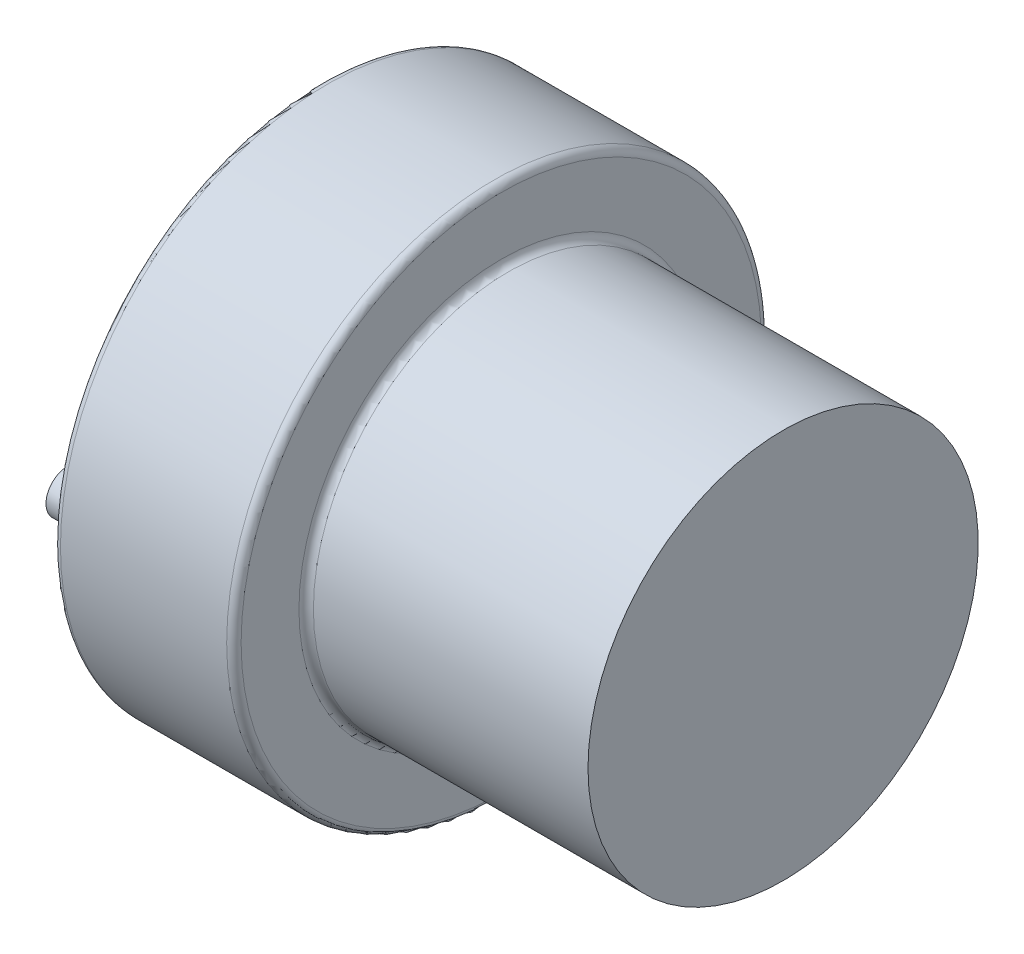
ISO-10303-21;
HEADER;
FILE_DESCRIPTION(('STEP AP214'),'2;1');
FILE_NAME('part.step','',(''),(''),'','','');
FILE_SCHEMA(('AUTOMOTIVE_DESIGN { 1 0 10303 214 1 1 1 1 }'));
ENDSEC;
DATA;
#1=APPLICATION_CONTEXT('core data for automotive mechanical design processes');
#2=APPLICATION_PROTOCOL_DEFINITION('international standard','automotive_design',2000,#1);
#3=PRODUCT_CONTEXT('',#1,'mechanical');
#4=PRODUCT('Part','Part','',(#3));
#5=PRODUCT_RELATED_PRODUCT_CATEGORY('part','',(#4));
#6=PRODUCT_DEFINITION_FORMATION('','',#4);
#7=PRODUCT_DEFINITION_CONTEXT('part definition',#1,'design');
#8=PRODUCT_DEFINITION('design','',#6,#7);
#9=PRODUCT_DEFINITION_SHAPE('','',#8);
#10=(LENGTH_UNIT() NAMED_UNIT(*) SI_UNIT(.MILLI.,.METRE.));
#11=(NAMED_UNIT(*) PLANE_ANGLE_UNIT() SI_UNIT($,.RADIAN.));
#12=(NAMED_UNIT(*) SI_UNIT($,.STERADIAN.) SOLID_ANGLE_UNIT());
#13=UNCERTAINTY_MEASURE_WITH_UNIT(LENGTH_MEASURE(1.E-05),#10,'distance_accuracy_value','');
#14=(GEOMETRIC_REPRESENTATION_CONTEXT(3) GLOBAL_UNCERTAINTY_ASSIGNED_CONTEXT((#13)) GLOBAL_UNIT_ASSIGNED_CONTEXT((#10,
#11,#12)) REPRESENTATION_CONTEXT('',''));
#15=CARTESIAN_POINT('',(0.,0.,0.));
#16=DIRECTION('',(0.,0.,1.));
#17=DIRECTION('',(1.,0.,0.));
#18=AXIS2_PLACEMENT_3D('',#15,#16,#17);
#19=CARTESIAN_POINT('',(47.3215054741171,37.,0.));
#20=DIRECTION('',(-1.,0.,0.));
#21=DIRECTION('',(0.,0.,1.));
#22=AXIS2_PLACEMENT_3D('',#19,#20,#21);
#23=PLANE('',#22);
#24=CARTESIAN_POINT('',(47.3215054741171,0.,0.));
#25=DIRECTION('',(-1.,0.,0.));
#26=DIRECTION('',(0.,0.,1.));
#27=AXIS2_PLACEMENT_3D('',#24,#25,#26);
#28=CIRCLE('',#27,28.);
#29=CARTESIAN_POINT('',(47.3215054741171,0.,28.));
#30=VERTEX_POINT('',#29);
#31=EDGE_CURVE('E129',#30,#30,#28,.T.);
#32=ORIENTED_EDGE('',*,*,#31,.T.);
#33=EDGE_LOOP('',(#32));
#34=FACE_BOUND('',#33,.T.);
#35=CARTESIAN_POINT('',(47.3215054741171,0.,0.));
#36=DIRECTION('',(-1.,0.,0.));
#37=DIRECTION('',(0.,0.,1.));
#38=AXIS2_PLACEMENT_3D('',#35,#36,#37);
#39=CIRCLE('',#38,36.);
#40=CARTESIAN_POINT('',(47.3215054741171,0.,36.));
#41=VERTEX_POINT('',#40);
#42=EDGE_CURVE('E132',#41,#41,#39,.F.);
#43=ORIENTED_EDGE('',*,*,#42,.T.);
#44=EDGE_LOOP('',(#43));
#45=FACE_BOUND('',#44,.T.);
#46=ADVANCED_FACE('F35',(#34,#45),#23,.F.);
#47=CARTESIAN_POINT('',(-66.563531294074,0.,0.));
#48=DIRECTION('',(-1.,0.,0.));
#49=DIRECTION('',(0.,0.,1.));
#50=AXIS2_PLACEMENT_3D('',#47,#48,#49);
#51=CYLINDRICAL_SURFACE('',#50,27.);
#52=CARTESIAN_POINT('',(48.3215054741171,0.,0.));
#53=DIRECTION('',(-1.,0.,0.));
#54=DIRECTION('',(0.,0.,1.));
#55=AXIS2_PLACEMENT_3D('',#52,#53,#54);
#56=CIRCLE('',#55,27.);
#57=CARTESIAN_POINT('',(48.3215054741171,0.,27.));
#58=VERTEX_POINT('',#57);
#59=EDGE_CURVE('E79',#58,#58,#56,.F.);
#60=ORIENTED_EDGE('',*,*,#59,.T.);
#61=EDGE_LOOP('',(#60));
#62=FACE_BOUND('',#61,.T.);
#63=CARTESIAN_POINT('',(86.3215054741171,0.,0.));
#64=DIRECTION('',(-1.,0.,0.));
#65=DIRECTION('',(0.,0.,1.));
#66=AXIS2_PLACEMENT_3D('',#63,#64,#65);
#67=CIRCLE('',#66,27.);
#68=CARTESIAN_POINT('',(86.3215054741171,0.,27.));
#69=VERTEX_POINT('',#68);
#70=EDGE_CURVE('E84',#69,#69,#67,.T.);
#71=ORIENTED_EDGE('',*,*,#70,.T.);
#72=EDGE_LOOP('',(#71));
#73=FACE_BOUND('',#72,.T.);
#74=ADVANCED_FACE('F168',(#62,#73),#51,.T.);
#75=CARTESIAN_POINT('',(86.3215054741171,27.,0.));
#76=DIRECTION('',(-1.,0.,0.));
#77=DIRECTION('',(0.,0.,1.));
#78=AXIS2_PLACEMENT_3D('',#75,#76,#77);
#79=PLANE('',#78);
#80=ORIENTED_EDGE('',*,*,#70,.F.);
#81=EDGE_LOOP('',(#80));
#82=FACE_BOUND('',#81,.T.);
#83=ADVANCED_FACE('F173',(#82),#79,.F.);
#84=CARTESIAN_POINT('',(22.3215054741171,0.,0.));
#85=DIRECTION('',(1.,0.,0.));
#86=DIRECTION('',(0.,0.,-1.));
#87=AXIS2_PLACEMENT_3D('',#84,#85,#86);
#88=PLANE('',#87);
#89=CARTESIAN_POINT('',(22.3215054741171,-29.8,0.));
#90=DIRECTION('',(1.,0.,0.));
#91=DIRECTION('',(0.,0.,-1.));
#92=AXIS2_PLACEMENT_3D('',#89,#90,#91);
#93=CIRCLE('',#92,7.);
#94=CARTESIAN_POINT('',(22.3215054741171,-35.8228187919463,-3.56730343528252));
#95=VERTEX_POINT('',#94);
#96=CARTESIAN_POINT('',(22.3215054741171,-35.8228187919463,3.56730343528252));
#97=VERTEX_POINT('',#96);
#98=EDGE_CURVE('E138',#95,#97,#93,.T.);
#99=ORIENTED_EDGE('',*,*,#98,.T.);
#100=CARTESIAN_POINT('',(22.3215054741171,0.,0.));
#101=DIRECTION('',(1.,0.,0.));
#102=DIRECTION('',(0.,0.,-1.));
#103=AXIS2_PLACEMENT_3D('',#100,#101,#102);
#104=CIRCLE('',#103,36.);
#105=EDGE_CURVE('E11',#97,#95,#104,.F.);
#106=ORIENTED_EDGE('',*,*,#105,.T.);
#107=EDGE_LOOP('',(#99,#106));
#108=FACE_BOUND('',#107,.T.);
#109=ADVANCED_FACE('F118',(#108),#88,.F.);
#110=CARTESIAN_POINT('',(-66.563531294074,0.,0.));
#111=DIRECTION('',(-1.,0.,0.));
#112=DIRECTION('',(0.,0.,1.));
#113=AXIS2_PLACEMENT_3D('',#110,#111,#112);
#114=CYLINDRICAL_SURFACE('',#113,37.);
#115=CARTESIAN_POINT('',(46.3215054741171,0.,0.));
#116=DIRECTION('',(-1.,0.,0.));
#117=DIRECTION('',(0.,0.,1.));
#118=AXIS2_PLACEMENT_3D('',#115,#116,#117);
#119=CIRCLE('',#118,37.);
#120=CARTESIAN_POINT('',(46.3215054741171,0.,37.));
#121=VERTEX_POINT('',#120);
#122=EDGE_CURVE('E75',#121,#121,#119,.T.);
#123=ORIENTED_EDGE('',*,*,#122,.T.);
#124=EDGE_LOOP('',(#123));
#125=FACE_BOUND('',#124,.T.);
#126=CARTESIAN_POINT('',(23.0496032626109,-36.5573468185837,-5.70617153490735));
#127=CARTESIAN_POINT('',(21.5795723692287,-36.6331610593214,-5.22045751886715));
#128=CARTESIAN_POINT('',(22.185554368364,-35.2065799035611,-5.20288610092809));
#129=CARTESIAN_POINT('',(23.0943157213255,-36.5785919458054,-5.57013755854584));
#130=CARTESIAN_POINT('',(21.6562160800355,-36.64182692597,-5.15348583219534));
#131=CARTESIAN_POINT('',(22.2079105976951,-35.2501493648659,-5.10217913031525));
#132=CARTESIAN_POINT('',(23.132081449152,-36.5993855184465,-5.43186633475085));
#133=CARTESIAN_POINT('',(21.7295336195492,-36.6526109350845,-5.07219857825357));
#134=CARTESIAN_POINT('',(22.2267934616215,-35.2941650324794,-4.99825919530411));
#135=CARTESIAN_POINT('',(23.195666505471,-36.6397407809534,-5.15257413559786));
#136=CARTESIAN_POINT('',(21.863858717514,-36.6764376530142,-4.89038965588562));
#137=CARTESIAN_POINT('',(22.2585859898072,-35.3822201060277,-4.78491327948831));
#138=CARTESIAN_POINT('',(23.2215123385418,-36.659305119534,-5.01155999463573));
#139=CARTESIAN_POINT('',(21.9255377931763,-36.689406368355,-4.79051951106501));
#140=CARTESIAN_POINT('',(22.2715089063556,-35.4262592391699,-4.67550012026306));
#141=CARTESIAN_POINT('',(23.263235040649,-36.6968344474696,-4.72891163866181));
#142=CARTESIAN_POINT('',(22.0361065105242,-36.7161692234794,-4.5778579154632));
#143=CARTESIAN_POINT('',(22.2923702573571,-35.5133780746318,-4.45244076123918));
#144=CARTESIAN_POINT('',(23.2791826330043,-36.7148099772626,-4.5872892776558));
#145=CARTESIAN_POINT('',(22.0856482904213,-36.7299508957794,-4.46544188879981));
#146=CARTESIAN_POINT('',(22.3003440534702,-35.5564624115411,-4.33883088490669));
#147=CARTESIAN_POINT('',(23.3031057226785,-36.7491994221087,-4.30311695377634));
#148=CARTESIAN_POINT('',(22.1736243090161,-36.7575493099456,-4.23096114213698));
#149=CARTESIAN_POINT('',(22.3123055983135,-35.6413946786779,-4.10692828013747));
#150=CARTESIAN_POINT('',(23.3110785702217,-36.7656128164716,-4.16056669841534));
#151=CARTESIAN_POINT('',(22.2125212503593,-36.7713976301361,-4.10892986892763));
#152=CARTESIAN_POINT('',(22.3162920221559,-35.6832421934663,-3.98863400877618));
#153=CARTESIAN_POINT('',(23.3177987707606,-36.787596624106,-3.95931882207973));
#154=CARTESIAN_POINT('',(22.2608635220134,-36.7906914753863,-3.93045708611478));
#155=CARTESIAN_POINT('',(22.3196521224444,-35.7409418503055,-3.81874077623764));
#156=CARTESIAN_POINT('',(23.3192138182394,-36.7938509370974,-3.90076946071516));
#157=CARTESIAN_POINT('',(22.2740159819821,-36.7962106472934,-3.87842591731761));
#158=CARTESIAN_POINT('',(22.3203596461797,-35.7575642615729,-3.76896944635886));
#159=CARTESIAN_POINT('',(23.3210671354643,-36.8060825639846,-3.78361656785558));
#160=CARTESIAN_POINT('',(22.2988158669579,-36.8071311318768,-3.77331907895815));
#161=CARTESIAN_POINT('',(22.3212863047866,-35.7904621249422,-3.66868739133214));
#162=CARTESIAN_POINT('',(23.321505274551,-36.8120598407227,-3.72501303016311));
#163=CARTESIAN_POINT('',(22.3104853876519,-36.8125360164771,-3.72023365454792));
#164=CARTESIAN_POINT('',(22.3215053743286,-35.8067375303444,-3.61817656818788));
#165=CARTESIAN_POINT('',(23.3215060558089,-36.8349114084879,-3.49553696715631));
#166=CARTESIAN_POINT('',(22.3529483028792,-36.8331934663434,-3.51278175748993));
#167=CARTESIAN_POINT('',(22.321505764979,-35.8696921710224,-3.4190193203605));
#168=CARTESIAN_POINT('',(23.3177859222851,-36.8507360726404,-3.32455728641397));
#169=CARTESIAN_POINT('',(22.3791923436772,-36.8481782356315,-3.35257624122744));
#170=CARTESIAN_POINT('',(22.3196456982918,-35.9149161127719,-3.26765703738701));
#171=CARTESIAN_POINT('',(23.3052853507849,-36.8799898663843,-2.98258568896001));
#172=CARTESIAN_POINT('',(22.421777661549,-36.8763545936427,-3.0269140085266));
#173=CARTESIAN_POINT('',(22.3133954123603,-36.0010814790415,-2.9590120428776));
#174=CARTESIAN_POINT('',(23.2965037839552,-36.893418460704,-2.8115937780299));
#175=CARTESIAN_POINT('',(22.4384531476647,-36.8896426716794,-2.86102241134309));
#176=CARTESIAN_POINT('',(22.3090046286893,-36.042021945809,-2.80172801793001));
#177=CARTESIAN_POINT('',(23.2761438787302,-36.9179001497763,-2.46943311257299));
#178=CARTESIAN_POINT('',(22.4643633709563,-36.9141315140195,-2.52537597550229));
#179=CARTESIAN_POINT('',(22.2988246760662,-36.1186654037567,-2.48137005992551));
#180=CARTESIAN_POINT('',(23.264562432058,-36.9289505784642,-2.29826437350549));
#181=CARTESIAN_POINT('',(22.4738021039878,-36.9254213025376,-2.35508242197954));
#182=CARTESIAN_POINT('',(22.2930339529761,-36.1543625027295,-2.31828986510513));
#183=CARTESIAN_POINT('',(23.2408004012371,-36.9486675426824,-1.95585606979238));
#184=CARTESIAN_POINT('',(22.487511968837,-36.9456928168072,-2.01190709983078));
#185=CARTESIAN_POINT('',(22.2811529377653,-36.2194733815791,-1.98698402275845));
#186=CARTESIAN_POINT('',(23.2286198834771,-36.9573343416662,-1.78461651507069));
#187=CARTESIAN_POINT('',(22.4919018464305,-36.9547545706858,-1.83841700547601));
#188=CARTESIAN_POINT('',(22.2750626788389,-36.2488878557702,-1.81875894616211));
#189=CARTESIAN_POINT('',(23.2056940785022,-36.9722933308398,-1.44186023317155));
#190=CARTESIAN_POINT('',(22.4975944072469,-36.9704384367619,-1.48960048829226));
#191=CARTESIAN_POINT('',(22.263599776267,-36.3005124793115,-1.47780893675089));
#192=CARTESIAN_POINT('',(23.1949493429095,-36.978584610049,-1.27034342494164));
#193=CARTESIAN_POINT('',(22.4989493524597,-36.9771243876591,-1.31359545049608));
#194=CARTESIAN_POINT('',(22.2582274084325,-36.3227198643794,-1.30508230473788));
#195=CARTESIAN_POINT('',(23.1766497326258,-36.9887828166206,-0.927054119491453));
#196=CARTESIAN_POINT('',(22.5002876239622,-36.9879601568902,-0.96059179457783));
#197=CARTESIAN_POINT('',(22.2490776033566,-36.3591065824519,-0.956276941473251));
#198=CARTESIAN_POINT('',(23.1690947664913,-36.9926898123365,-0.755281629742683));
#199=CARTESIAN_POINT('',(22.500286594406,-36.9921565119264,-0.782858970981471));
#200=CARTESIAN_POINT('',(22.2453001203934,-36.3732861456002,-0.780198306467286));
#201=CARTESIAN_POINT('',(23.1584287872938,-36.9981075478377,-0.41172567372295));
#202=CARTESIAN_POINT('',(22.500104283379,-36.9979582380011,-0.427396354164905));
#203=CARTESIAN_POINT('',(22.2399671306164,-36.3930306231839,-0.42631100465247));
#204=CARTESIAN_POINT('',(23.1553131097378,-36.9996208029823,-0.239942408916912));
#205=CARTESIAN_POINT('',(22.4999236917539,-36.999591828673,-0.248894040099966));
#206=CARTESIAN_POINT('',(22.2384092915566,-36.398604580302,-0.248504351667758));
#207=CARTESIAN_POINT('',(23.1540145132723,-37.000253681395,0.103647521352708));
#208=CARTESIAN_POINT('',(22.4998532241512,-37.0002731418973,0.107437709730619));
#209=CARTESIAN_POINT('',(22.2377599933074,-36.4009340850238,0.107341089168888));
#210=CARTESIAN_POINT('',(23.155831556064,-36.9993733232478,0.275454186624248));
#211=CARTESIAN_POINT('',(22.4999630194116,-36.9993239095812,0.286057435108324));
#212=CARTESIAN_POINT('',(22.2386685149686,-36.397689701095,0.285379875207761));
#213=CARTESIAN_POINT('',(23.166522897989,-36.9940419931226,0.716519274867622));
#214=CARTESIAN_POINT('',(22.5003250929783,-36.993593668793,0.743342362099668));
#215=CARTESIAN_POINT('',(22.2440141862443,-36.3781742184994,0.740724941661782));
#216=CARTESIAN_POINT('',(23.1788212807392,-36.9878460189078,0.985666408513064));
#217=CARTESIAN_POINT('',(22.5006251270284,-36.9868835702444,1.02286424840874));
#218=CARTESIAN_POINT('',(22.2501633774581,-36.3555473251459,1.01693875802849));
#219=CARTESIAN_POINT('',(23.2102244512467,-36.9696024560881,1.52347989689025));
#220=CARTESIAN_POINT('',(22.4969529296883,-36.9675688254964,1.57444304943322));
#221=CARTESIAN_POINT('',(22.2658649626248,-36.2910447314259,1.56029980213849));
#222=CARTESIAN_POINT('',(23.2293343592609,-36.9575504630031,1.79214573672455));
#223=CARTESIAN_POINT('',(22.4928848495874,-36.9547570211431,1.84926629790581));
#224=CARTESIAN_POINT('',(22.2754199167065,-36.2491545438549,1.82744004332052));
#225=CARTESIAN_POINT('',(23.2667322862324,-36.9276382375231,2.32839928535308));
#226=CARTESIAN_POINT('',(22.4733818881282,-36.9239112548409,2.38799861611297));
#227=CARTESIAN_POINT('',(22.2941188801574,-36.1497605449315,2.34833492332293));
#228=CARTESIAN_POINT('',(23.2850226039061,-36.9097955802178,2.59598780673007));
#229=CARTESIAN_POINT('',(22.4575635755883,-36.9055916418608,2.65432849604766));
#230=CARTESIAN_POINT('',(22.3032640388855,-36.0923040645138,2.60212739863556));
#231=CARTESIAN_POINT('',(23.3124092283033,-36.8682403473535,3.1312641280184));
#232=CARTESIAN_POINT('',(22.406513813467,-36.8646306397308,3.17341403957862));
#233=CARTESIAN_POINT('',(22.3169573511661,-35.9655176730531,3.09555241750385));
#234=CARTESIAN_POINT('',(23.321508305211,-36.8445295431024,3.39895187367705));
#235=CARTESIAN_POINT('',(22.3702746164429,-36.8416264760928,3.42805989764088));
#236=CARTESIAN_POINT('',(22.3215068898107,-35.8961913468812,3.33518920698389));
#237=CARTESIAN_POINT('',(23.3215036583917,-36.8008163373736,3.83792029092276));
#238=CARTESIAN_POINT('',(22.2889226399398,-36.8020434072165,3.82562784284298));
#239=CARTESIAN_POINT('',(22.3215045661604,-35.7757612166246,3.71617017150417));
#240=CARTESIAN_POINT('',(23.317757942586,-36.7825338179751,4.00934484605691));
#241=CARTESIAN_POINT('',(22.2505630305021,-36.7857730311227,3.97852937586324));
#242=CARTESIAN_POINT('',(22.3196317080247,-35.7270393005748,3.86194264250082));
#243=CARTESIAN_POINT('',(23.3002134162989,-36.7436541259377,4.35125839047812));
#244=CARTESIAN_POINT('',(22.1602530145498,-36.7528561785761,4.27274940354854));
#245=CARTESIAN_POINT('',(22.3108594448795,-35.6273075084333,4.14688908586378));
#246=CARTESIAN_POINT('',(23.2864245786389,-36.7230592666,4.52174813894454));
#247=CARTESIAN_POINT('',(22.1076209891147,-36.7361343160085,4.41417673429082));
#248=CARTESIAN_POINT('',(22.3039650262802,-35.5762999491056,4.28606945827469));
#249=CARTESIAN_POINT('',(23.2456954411636,-36.6793817336019,4.86343485984208));
#250=CARTESIAN_POINT('',(21.9860618953946,-36.7031894791066,4.68278083457799));
#251=CARTESIAN_POINT('',(22.2836004577397,-35.4722216155292,4.55952898543568));
#252=CARTESIAN_POINT('',(23.2185660215549,-36.6562671207984,5.03460580017402));
#253=CARTESIAN_POINT('',(21.9159952507171,-36.6869610895821,4.80937311539495));
#254=CARTESIAN_POINT('',(22.2700357478978,-35.4191315889688,4.69370688119169));
#255=CARTESIAN_POINT('',(23.1654063891174,-36.6201661407214,5.28874348489617));
#256=CARTESIAN_POINT('',(21.8001122763335,-36.6648751659663,4.97879120252823));
#257=CARTESIAN_POINT('',(22.2434559315862,-35.3393422350653,4.88914286903021));
#258=CARTESIAN_POINT('',(23.1455581949763,-36.6078690300226,5.37318097110978));
#259=CARTESIAN_POINT('',(21.7586525459222,-36.6577539430218,5.03284514346185));
#260=CARTESIAN_POINT('',(22.2335318344785,-35.3126681241832,4.95343551263273));
#261=CARTESIAN_POINT('',(23.1011992450535,-36.5828810932661,5.54075949188271));
#262=CARTESIAN_POINT('',(21.6717844918171,-36.6445273886687,5.13330919979478));
#263=CARTESIAN_POINT('',(22.2113523594955,-35.2594644993986,5.07984894998553));
#264=CARTESIAN_POINT('',(23.0766848646007,-36.5701899675961,5.6238994638538));
#265=CARTESIAN_POINT('',(21.6262269201754,-36.6384462481235,5.17953767404167));
#266=CARTESIAN_POINT('',(22.1990951692845,-35.2329351145083,5.14196801060245));
#267=CARTESIAN_POINT('',(23.0496032626109,-36.5573468185837,5.70617153490735));
#268=CARTESIAN_POINT('',(21.5795723692287,-36.6331610593214,5.22045751886715));
#269=CARTESIAN_POINT('',(22.185554368364,-35.2065799035611,5.20288610092809));
#270=(BOUNDED_SURFACE() B_SPLINE_SURFACE(3,2,((#126,#127,#128),(#129,#130,#131),(#132,#133,
#134),(#135,#136,#137),(#138,#139,#140),(#141,#142,#143),(#144,#145,#146),(#147,#148,#149),
(#150,#151,#152),(#153,#154,#155),(#156,#157,#158),(#159,#160,#161),(#162,#163,#164),(#165,#166,
#167),(#168,#169,#170),(#171,#172,#173),(#174,#175,#176),(#177,#178,#179),(#180,#181,#182),
(#183,#184,#185),(#186,#187,#188),(#189,#190,#191),(#192,#193,#194),(#195,#196,#197),(#198,#199,
#200),(#201,#202,#203),(#204,#205,#206),(#207,#208,#209),(#210,#211,#212),(#213,#214,#215),
(#216,#217,#218),(#219,#220,#221),(#222,#223,#224),(#225,#226,#227),(#228,#229,#230),(#231,#232,
#233),(#234,#235,#236),(#237,#238,#239),(#240,#241,#242),(#243,#244,#245),(#246,#247,#248),
(#249,#250,#251),(#252,#253,#254),(#255,#256,#257),(#258,#259,#260),(#261,#262,#263),(#264,#265,
#266),(#267,#268,#269)),.UNSPECIFIED.,.F.,.F.,.F.) B_SPLINE_SURFACE_WITH_KNOTS((4,2,2,2,2,2,2,2,
2,2,2,2,2,2,2,2,2,2,2,2,2,2,2,4),(3,3),(0.,0.423171194754726,0.845396852538947,1.26456987402438,
1.68388212829601,1.85580228993566,2.02774544413813,2.52892233224609,3.03021104130214,
3.53205883061682,4.03385113028462,4.5358356657642,5.03780580949695,5.53924812828767,
6.04068655378014,6.82712115155287,7.61414816715141,8.39880849355285,9.18323225745548,
9.68632337083891,10.1889155945841,10.6988475442625,10.9548094023539,11.2109709078574),(0.,1.),
.UNSPECIFIED.) GEOMETRIC_REPRESENTATION_ITEM() RATIONAL_B_SPLINE_SURFACE(((1.,0.542114384049951,
1.),(1.,0.555301249229401,1.),(1.,0.56819274321148,1.),(1.,0.593272453272403,1.),(1.,
0.605462176399014,1.),(1.,0.629000092634734,1.),(1.,0.640353732726706,1.),(1.,0.662274963036664,
1.),(1.,0.672842290907151,1.),(1.,0.687152800273148,1.),(1.,0.691243770074069,1.),(1.,
0.69928311077072,1.),(1.,0.703231462522132,1.),(1.,0.71840249201416,1.),(1.,0.729077716895125,
1.),(1.,0.749102323794786,1.),(1.,0.758451409464334,1.),(1.,0.77573412183015,1.),(1.,
0.783666158255921,1.),(1.,0.797992922280736,1.),(1.,0.804387819764073,1.),(1.,0.81553232451636,
1.),(1.,0.820281300538769,1.),(1.,0.828028510617019,1.),(1.,0.831026794862207,1.),(1.,
0.835194872800186,1.),(1.,0.836366585847844,1.),(1.,0.836856406743662,1.),(1.,0.836174528983513,
1.),(1.,0.832062036856668,1.),(1.,0.827289425028965,1.),(1.,0.813504948999191,1.),(1.,
0.804489894094641,1.),(1.,0.782679827255224,1.),(1.,0.769896263647825,1.),(1.,0.740950146480258,
1.),(1.,0.724788612793276,1.),(1.,0.695766517468082,1.),(1.,0.68380090755817,1.),(1.,
0.658704709412185,1.),(1.,0.645575288191918,1.),(1.,0.618012860451391,1.),(1.,0.603563616812209,
1.),(1.,0.581102132834378,1.),(1.,0.573468109178326,1.),(1.,0.557962423945481,1.),(1.,
0.550090581658153,1.),(1.,0.542114384049951,1.))) REPRESENTATION_ITEM('') SURFACE());
#271=CARTESIAN_POINT('',(23.0496032626109,-36.5573468185837,5.70617153490735));
#272=CARTESIAN_POINT('',(23.0766848646007,-36.5701899675961,5.6238994638538));
#273=CARTESIAN_POINT('',(23.1011992450535,-36.5828810932661,5.5407594918827));
#274=CARTESIAN_POINT('',(23.1455581949763,-36.6078690300226,5.37318097110978));
#275=CARTESIAN_POINT('',(23.1654063891174,-36.6201661407214,5.28874348489617));
#276=CARTESIAN_POINT('',(23.2185660215549,-36.6562671207984,5.03460580017402));
#277=CARTESIAN_POINT('',(23.2456954411636,-36.6793817336019,4.86343485984208));
#278=CARTESIAN_POINT('',(23.2864245786389,-36.7230592666,4.52174813894454));
#279=CARTESIAN_POINT('',(23.3002134162989,-36.7436541259377,4.35125839047812));
#280=CARTESIAN_POINT('',(23.317757942586,-36.7825338179751,4.00934484605691));
#281=CARTESIAN_POINT('',(23.3215036583917,-36.8008163373736,3.83792029092276));
#282=CARTESIAN_POINT('',(23.321508305211,-36.8445295431024,3.39895187367705));
#283=CARTESIAN_POINT('',(23.3124092283033,-36.8682403473535,3.1312641280184));
#284=CARTESIAN_POINT('',(23.2850226039061,-36.9097955802178,2.59598780673007));
#285=CARTESIAN_POINT('',(23.2667322862324,-36.9276382375231,2.32839928535308));
#286=CARTESIAN_POINT('',(23.2293343592609,-36.9575504630031,1.79214573672455));
#287=CARTESIAN_POINT('',(23.2102244512467,-36.9696024560881,1.52347989689025));
#288=CARTESIAN_POINT('',(23.1788212807392,-36.9878460189078,0.985666408513064));
#289=CARTESIAN_POINT('',(23.166522897989,-36.9940419931226,0.716519274867622));
#290=CARTESIAN_POINT('',(23.155831556064,-36.9993733232478,0.275454186624248));
#291=CARTESIAN_POINT('',(23.1540145132723,-37.000253681395,0.103647521352708));
#292=CARTESIAN_POINT('',(23.1553131097378,-36.9996208029823,-0.239942408916912));
#293=CARTESIAN_POINT('',(23.1584287872938,-36.9981075478377,-0.41172567372295));
#294=CARTESIAN_POINT('',(23.1690947664913,-36.9926898123365,-0.755281629742683));
#295=CARTESIAN_POINT('',(23.1766497326258,-36.9887828166206,-0.927054119491453));
#296=CARTESIAN_POINT('',(23.1949493429095,-36.978584610049,-1.27034342494164));
#297=CARTESIAN_POINT('',(23.2056940785022,-36.9722933308398,-1.44186023317155));
#298=CARTESIAN_POINT('',(23.2286198834771,-36.9573343416662,-1.78461651507069));
#299=CARTESIAN_POINT('',(23.2408004012371,-36.9486675426824,-1.95585606979238));
#300=CARTESIAN_POINT('',(23.264562432058,-36.9289505784642,-2.29826437350549));
#301=CARTESIAN_POINT('',(23.2761438787302,-36.9179001497763,-2.46943311257299));
#302=CARTESIAN_POINT('',(23.2965037839552,-36.893418460704,-2.8115937780299));
#303=CARTESIAN_POINT('',(23.3052853507849,-36.8799898663843,-2.98258568896001));
#304=CARTESIAN_POINT('',(23.3177859222851,-36.8507360726404,-3.32455728641397));
#305=CARTESIAN_POINT('',(23.3215060558089,-36.8349114084879,-3.49553696715631));
#306=CARTESIAN_POINT('',(23.321505274551,-36.8120598407227,-3.72501303016311));
#307=CARTESIAN_POINT('',(23.3210671354643,-36.8060825639846,-3.78361656785558));
#308=CARTESIAN_POINT('',(23.3192138182394,-36.7938509370974,-3.90076946071516));
#309=CARTESIAN_POINT('',(23.3177987707606,-36.787596624106,-3.95931882207973));
#310=CARTESIAN_POINT('',(23.3110785702217,-36.7656128164716,-4.16056669841534));
#311=CARTESIAN_POINT('',(23.3031057226785,-36.7491994221087,-4.30311695377634));
#312=CARTESIAN_POINT('',(23.2791826330043,-36.7148099772626,-4.5872892776558));
#313=CARTESIAN_POINT('',(23.263235040649,-36.6968344474696,-4.72891163866181));
#314=CARTESIAN_POINT('',(23.2215123385418,-36.659305119534,-5.01155999463573));
#315=CARTESIAN_POINT('',(23.195666505471,-36.6397407809534,-5.15257413559787));
#316=CARTESIAN_POINT('',(23.132081449152,-36.5993855184465,-5.43186633475085));
#317=CARTESIAN_POINT('',(23.0943157213255,-36.5785919458054,-5.57013755854584));
#318=CARTESIAN_POINT('',(23.0496032626109,-36.5573468185837,-5.70617153490735));
#319=B_SPLINE_CURVE_WITH_KNOTS('',3,(#271,#272,#273,#274,#275,#276,#277,#278,#279,#280,#281,
#282,#283,#284,#285,#286,#287,#288,#289,#290,#291,#292,#293,#294,#295,#296,#297,#298,#299,#300,
#301,#302,#303,#304,#305,#306,#307,#308,#309,#310,#311,#312,#313,#314,#315,#316,#317,#318),
.UNSPECIFIED.,.F.,.F.,(4,2,2,2,2,2,2,2,2,2,2,2,2,2,2,2,2,2,2,2,2,2,2,4),(0.,0.256161505503526,
0.512123363594933,1.02205531327336,1.52464753701854,2.02773865040196,2.81216241430459,
3.59682274070604,4.38384975630458,5.17028435407731,5.67172277956978,6.1731650983605,
6.67513524209324,7.17711977757283,7.67891207724063,8.18075986655531,8.68204857561136,
9.18322546371932,9.35516861792179,9.52708877956144,9.94640103383307,10.3655740553185,
10.7877997131027,11.2109709078574),.UNSPECIFIED.);
#320=CARTESIAN_POINT('',(23.3215054741171,-36.8178970917226,3.6663951973737));
#321=VERTEX_POINT('',#320);
#322=CARTESIAN_POINT('',(23.3215054741171,-36.8178970917226,-3.6663951973737));
#323=VERTEX_POINT('',#322);
#324=EDGE_CURVE('E72',#321,#323,#319,.T.);
#325=ORIENTED_EDGE('',*,*,#324,.T.);
#326=CARTESIAN_POINT('',(23.3215054741171,0.,0.));
#327=DIRECTION('',(1.,0.,0.));
#328=DIRECTION('',(0.,0.,-1.));
#329=AXIS2_PLACEMENT_3D('',#326,#327,#328);
#330=CIRCLE('',#329,37.);
#331=EDGE_CURVE('E70',#323,#321,#330,.T.);
#332=ORIENTED_EDGE('',*,*,#331,.T.);
#333=EDGE_LOOP('',(#325,#332));
#334=FACE_BOUND('',#333,.T.);
#335=ADVANCED_FACE('F71',(#125,#334),#114,.T.);
#336=CARTESIAN_POINT('',(12.3215054741171,-29.8,0.));
#337=DIRECTION('',(1.,0.,0.));
#338=DIRECTION('',(0.,0.,-1.));
#339=AXIS2_PLACEMENT_3D('',#336,#337,#338);
#340=CYLINDRICAL_SURFACE('',#339,6.);
#341=CARTESIAN_POINT('',(21.3215054741171,-29.8,0.));
#342=DIRECTION('',(1.,0.,0.));
#343=DIRECTION('',(0.,0.,-1.));
#344=AXIS2_PLACEMENT_3D('',#341,#342,#343);
#345=CIRCLE('',#344,6.);
#346=CARTESIAN_POINT('',(21.3215054741171,-29.8,-6.));
#347=VERTEX_POINT('',#346);
#348=EDGE_CURVE('E140',#347,#347,#345,.F.);
#349=ORIENTED_EDGE('',*,*,#348,.T.);
#350=EDGE_LOOP('',(#349));
#351=FACE_BOUND('',#350,.T.);
#352=CARTESIAN_POINT('',(13.3215054741171,-29.8,0.));
#353=DIRECTION('',(-1.,0.,0.));
#354=DIRECTION('',(0.,0.,1.));
#355=AXIS2_PLACEMENT_3D('',#352,#353,#354);
#356=CIRCLE('',#355,6.);
#357=CARTESIAN_POINT('',(13.3215054741171,-29.8,6.));
#358=VERTEX_POINT('',#357);
#359=EDGE_CURVE('E143',#358,#358,#356,.F.);
#360=ORIENTED_EDGE('',*,*,#359,.T.);
#361=EDGE_LOOP('',(#360));
#362=FACE_BOUND('',#361,.T.);
#363=ADVANCED_FACE('F117',(#351,#362),#340,.T.);
#364=CARTESIAN_POINT('',(12.3215054741171,-29.8,0.));
#365=DIRECTION('',(-1.,0.,0.));
#366=DIRECTION('',(0.,0.,1.));
#367=AXIS2_PLACEMENT_3D('',#364,#365,#366);
#368=PLANE('',#367);
#369=CARTESIAN_POINT('',(12.3215054741171,-29.8,0.));
#370=DIRECTION('',(-1.,0.,0.));
#371=DIRECTION('',(0.,0.,1.));
#372=AXIS2_PLACEMENT_3D('',#369,#370,#371);
#373=CIRCLE('',#372,3.);
#374=CARTESIAN_POINT('',(12.3215054741171,-29.8,3.));
#375=VERTEX_POINT('',#374);
#376=EDGE_CURVE('E86',#375,#375,#373,.T.);
#377=ORIENTED_EDGE('',*,*,#376,.F.);
#378=EDGE_LOOP('',(#377));
#379=FACE_BOUND('',#378,.T.);
#380=CARTESIAN_POINT('',(12.3215054741171,-29.8,0.));
#381=DIRECTION('',(-1.,0.,0.));
#382=DIRECTION('',(0.,0.,1.));
#383=AXIS2_PLACEMENT_3D('',#380,#381,#382);
#384=CIRCLE('',#383,5.);
#385=CARTESIAN_POINT('',(12.3215054741171,-29.8,5.));
#386=VERTEX_POINT('',#385);
#387=EDGE_CURVE('E135',#386,#386,#384,.T.);
#388=ORIENTED_EDGE('',*,*,#387,.T.);
#389=EDGE_LOOP('',(#388));
#390=FACE_BOUND('',#389,.T.);
#391=ADVANCED_FACE('F152',(#379,#390),#368,.T.);
#392=CARTESIAN_POINT('',(21.3215054741171,-29.8,0.));
#393=DIRECTION('',(1.,0.,0.));
#394=DIRECTION('',(0.,0.,-1.));
#395=AXIS2_PLACEMENT_3D('',#392,#393,#394);
#396=TOROIDAL_SURFACE('',#395,7.,1.);
#397=ORIENTED_EDGE('',*,*,#98,.F.);
#398=CARTESIAN_POINT('',(22.185554368364,-35.2065799035611,-5.20288610092809));
#399=CARTESIAN_POINT('',(22.2079105976951,-35.2501493648659,-5.10217913031525));
#400=CARTESIAN_POINT('',(22.2267934616215,-35.2941650324794,-4.99825919530411));
#401=CARTESIAN_POINT('',(22.2585859898072,-35.3822201060277,-4.78491327948831));
#402=CARTESIAN_POINT('',(22.2715089063556,-35.4262592391699,-4.67550012026306));
#403=CARTESIAN_POINT('',(22.2923702573571,-35.5133780746318,-4.45244076123918));
#404=CARTESIAN_POINT('',(22.3003440534702,-35.5564624115411,-4.33883088490669));
#405=CARTESIAN_POINT('',(22.3123055983135,-35.6413946786779,-4.10692828013747));
#406=CARTESIAN_POINT('',(22.3162920221559,-35.6832421934663,-3.98863400877618));
#407=CARTESIAN_POINT('',(22.3196521224444,-35.7409418503055,-3.81874077623764));
#408=CARTESIAN_POINT('',(22.3203596461797,-35.7575642615729,-3.76896944635886));
#409=CARTESIAN_POINT('',(22.3212863047866,-35.7904621249422,-3.66868739133214));
#410=CARTESIAN_POINT('',(22.3215053743286,-35.8067375303444,-3.61817656818788));
#411=CARTESIAN_POINT('',(22.3215057649791,-35.8696921710224,-3.4190193203605));
#412=CARTESIAN_POINT('',(22.3196456982918,-35.9149161127719,-3.26765703738701));
#413=CARTESIAN_POINT('',(22.3133954123603,-36.0010814790415,-2.9590120428776));
#414=CARTESIAN_POINT('',(22.3090046286893,-36.042021945809,-2.80172801793001));
#415=CARTESIAN_POINT('',(22.2988246760662,-36.1186654037567,-2.48137005992551));
#416=CARTESIAN_POINT('',(22.2930339529761,-36.1543625027295,-2.31828986510513));
#417=CARTESIAN_POINT('',(22.2811529377653,-36.2194733815791,-1.98698402275845));
#418=CARTESIAN_POINT('',(22.2750626788389,-36.2488878557702,-1.81875894616211));
#419=CARTESIAN_POINT('',(22.263599776267,-36.3005124793115,-1.47780893675089));
#420=CARTESIAN_POINT('',(22.2582274084325,-36.3227198643794,-1.30508230473788));
#421=CARTESIAN_POINT('',(22.2490776033566,-36.3591065824519,-0.956276941473252));
#422=CARTESIAN_POINT('',(22.2453001203934,-36.3732861456002,-0.780198306467286));
#423=CARTESIAN_POINT('',(22.2399671306164,-36.3930306231839,-0.42631100465247));
#424=CARTESIAN_POINT('',(22.2384092915566,-36.398604580302,-0.248504351667757));
#425=CARTESIAN_POINT('',(22.2377599933074,-36.4009340850238,0.107341089168888));
#426=CARTESIAN_POINT('',(22.2386685149686,-36.397689701095,0.285379875207761));
#427=CARTESIAN_POINT('',(22.2440141862444,-36.3781742184994,0.740724941661782));
#428=CARTESIAN_POINT('',(22.2501633774581,-36.3555473251459,1.01693875802849));
#429=CARTESIAN_POINT('',(22.2658649626248,-36.2910447314259,1.56029980213849));
#430=CARTESIAN_POINT('',(22.2754199167065,-36.2491545438549,1.82744004332052));
#431=CARTESIAN_POINT('',(22.2941188801574,-36.1497605449315,2.34833492332293));
#432=CARTESIAN_POINT('',(22.3032640388855,-36.0923040645139,2.60212739863556));
#433=CARTESIAN_POINT('',(22.3169573511661,-35.9655176730531,3.09555241750385));
#434=CARTESIAN_POINT('',(22.3215068898107,-35.8961913468812,3.33518920698389));
#435=CARTESIAN_POINT('',(22.3215045661604,-35.7757612166246,3.71617017150417));
#436=CARTESIAN_POINT('',(22.3196317080247,-35.7270393005748,3.86194264250083));
#437=CARTESIAN_POINT('',(22.3108594448795,-35.6273075084333,4.14688908586378));
#438=CARTESIAN_POINT('',(22.3039650262802,-35.5762999491056,4.28606945827469));
#439=CARTESIAN_POINT('',(22.2836004577397,-35.4722216155292,4.55952898543568));
#440=CARTESIAN_POINT('',(22.2700357478978,-35.4191315889688,4.69370688119169));
#441=CARTESIAN_POINT('',(22.2434559315862,-35.3393422350653,4.88914286903021));
#442=CARTESIAN_POINT('',(22.2335318344785,-35.3126681241832,4.95343551263274));
#443=CARTESIAN_POINT('',(22.2113523594955,-35.2594644993986,5.07984894998553));
#444=CARTESIAN_POINT('',(22.1990951692845,-35.2329351145083,5.14196801060245));
#445=CARTESIAN_POINT('',(22.185554368364,-35.2065799035611,5.20288610092809));
#446=B_SPLINE_CURVE_WITH_KNOTS('',3,(#398,#399,#400,#401,#402,#403,#404,#405,#406,#407,#408,
#409,#410,#411,#412,#413,#414,#415,#416,#417,#418,#419,#420,#421,#422,#423,#424,#425,#426,#427,
#428,#429,#430,#431,#432,#433,#434,#435,#436,#437,#438,#439,#440,#441,#442,#443,#444,#445),
.UNSPECIFIED.,.F.,.F.,(4,2,2,2,2,2,2,2,2,2,2,2,2,2,2,2,2,2,2,2,2,2,2,4),(0.,0.423171194754726,
0.845396852538947,1.26456987402438,1.68388212829601,1.85580228993566,2.02774544413813,
2.52892233224609,3.03021104130214,3.53205883061682,4.03385113028462,4.5358356657642,
5.03780580949695,5.53924812828767,6.04068655378014,6.82712115155287,7.61414816715141,
8.39880849355285,9.18323225745548,9.68632337083891,10.1889155945841,10.6988475442625,
10.9548094023539,11.2109709078574),.UNSPECIFIED.);
#447=EDGE_CURVE('E48',#95,#97,#446,.T.);
#448=ORIENTED_EDGE('',*,*,#447,.T.);
#449=EDGE_LOOP('',(#397,#448));
#450=FACE_BOUND('',#449,.T.);
#451=ORIENTED_EDGE('',*,*,#348,.F.);
#452=EDGE_LOOP('',(#451));
#453=FACE_BOUND('',#452,.T.);
#454=ADVANCED_FACE('F95',(#450,#453),#396,.F.);
#455=CARTESIAN_POINT('',(13.3215054741171,-29.8,0.));
#456=DIRECTION('',(-1.,0.,0.));
#457=DIRECTION('',(0.,0.,1.));
#458=AXIS2_PLACEMENT_3D('',#455,#456,#457);
#459=TOROIDAL_SURFACE('',#458,5.,1.);
#460=ORIENTED_EDGE('',*,*,#359,.F.);
#461=EDGE_LOOP('',(#460));
#462=FACE_BOUND('',#461,.T.);
#463=ORIENTED_EDGE('',*,*,#387,.F.);
#464=EDGE_LOOP('',(#463));
#465=FACE_BOUND('',#464,.T.);
#466=ADVANCED_FACE('F157',(#462,#465),#459,.T.);
#467=CARTESIAN_POINT('',(48.3215054741171,0.,0.));
#468=DIRECTION('',(-1.,0.,0.));
#469=DIRECTION('',(0.,0.,1.));
#470=AXIS2_PLACEMENT_3D('',#467,#468,#469);
#471=TOROIDAL_SURFACE('',#470,28.,1.);
#472=ORIENTED_EDGE('',*,*,#59,.F.);
#473=EDGE_LOOP('',(#472));
#474=FACE_BOUND('',#473,.T.);
#475=ORIENTED_EDGE('',*,*,#31,.F.);
#476=EDGE_LOOP('',(#475));
#477=FACE_BOUND('',#476,.T.);
#478=ADVANCED_FACE('F104',(#474,#477),#471,.F.);
#479=CARTESIAN_POINT('',(46.3215054741171,0.,0.));
#480=DIRECTION('',(-1.,0.,0.));
#481=DIRECTION('',(0.,0.,1.));
#482=AXIS2_PLACEMENT_3D('',#479,#480,#481);
#483=TOROIDAL_SURFACE('',#482,36.,1.);
#484=ORIENTED_EDGE('',*,*,#42,.F.);
#485=EDGE_LOOP('',(#484));
#486=FACE_BOUND('',#485,.T.);
#487=ORIENTED_EDGE('',*,*,#122,.F.);
#488=EDGE_LOOP('',(#487));
#489=FACE_BOUND('',#488,.T.);
#490=ADVANCED_FACE('F110',(#486,#489),#483,.T.);
#491=CARTESIAN_POINT('',(23.3215054741171,0.,0.));
#492=DIRECTION('',(1.,0.,0.));
#493=DIRECTION('',(0.,0.,-1.));
#494=AXIS2_PLACEMENT_3D('',#491,#492,#493);
#495=TOROIDAL_SURFACE('',#494,36.,1.);
#496=CARTESIAN_POINT('',(23.3215054741171,-35.8228187919463,3.56730343528252));
#497=DIRECTION('',(0.,-0.0990917620911812,-0.995078299776286));
#498=DIRECTION('',(0.,0.995078299776286,-0.0990917620911812));
#499=AXIS2_PLACEMENT_3D('',#496,#497,#498);
#500=CIRCLE('',#499,1.);
#501=EDGE_CURVE('E61',#321,#97,#500,.T.);
#502=ORIENTED_EDGE('',*,*,#501,.F.);
#503=ORIENTED_EDGE('',*,*,#331,.F.);
#504=CARTESIAN_POINT('',(23.3215054741171,-35.8228187919463,-3.56730343528252));
#505=DIRECTION('',(0.,-0.0990917620911805,0.995078299776286));
#506=DIRECTION('',(0.,-0.995078299776286,-0.0990917620911805));
#507=AXIS2_PLACEMENT_3D('',#504,#505,#506);
#508=CIRCLE('',#507,1.);
#509=EDGE_CURVE('E78',#95,#323,#508,.T.);
#510=ORIENTED_EDGE('',*,*,#509,.F.);
#511=ORIENTED_EDGE('',*,*,#105,.F.);
#512=EDGE_LOOP('',(#502,#503,#510,#511));
#513=FACE_BOUND('',#512,.T.);
#514=ADVANCED_FACE('F37',(#513),#495,.T.);
#515=ORIENTED_EDGE('',*,*,#509,.T.);
#516=ORIENTED_EDGE('',*,*,#324,.F.);
#517=ORIENTED_EDGE('',*,*,#501,.T.);
#518=ORIENTED_EDGE('',*,*,#447,.F.);
#519=EDGE_LOOP('',(#515,#516,#517,#518));
#520=FACE_BOUND('',#519,.T.);
#521=ADVANCED_FACE('F77',(#520),#270,.T.);
#522=CARTESIAN_POINT('',(-12.6784945258829,-29.8,0.));
#523=DIRECTION('',(1.,0.,0.));
#524=DIRECTION('',(0.,0.,-1.));
#525=AXIS2_PLACEMENT_3D('',#522,#523,#524);
#526=CYLINDRICAL_SURFACE('',#525,3.);
#527=CARTESIAN_POINT('',(-12.6784945258829,-29.8,0.));
#528=DIRECTION('',(-1.,0.,0.));
#529=DIRECTION('',(0.,0.,1.));
#530=AXIS2_PLACEMENT_3D('',#527,#528,#529);
#531=CIRCLE('',#530,3.);
#532=CARTESIAN_POINT('',(-12.6784945258829,-29.8,3.));
#533=VERTEX_POINT('',#532);
#534=EDGE_CURVE('E82',#533,#533,#531,.T.);
#535=ORIENTED_EDGE('',*,*,#534,.F.);
#536=EDGE_LOOP('',(#535));
#537=FACE_BOUND('',#536,.T.);
#538=ORIENTED_EDGE('',*,*,#376,.T.);
#539=EDGE_LOOP('',(#538));
#540=FACE_BOUND('',#539,.T.);
#541=ADVANCED_FACE('F109',(#537,#540),#526,.T.);
#542=CARTESIAN_POINT('',(-12.6784945258829,-29.8,0.));
#543=DIRECTION('',(-1.,0.,0.));
#544=DIRECTION('',(0.,0.,1.));
#545=AXIS2_PLACEMENT_3D('',#542,#543,#544);
#546=PLANE('',#545);
#547=ORIENTED_EDGE('',*,*,#534,.T.);
#548=EDGE_LOOP('',(#547));
#549=FACE_BOUND('',#548,.T.);
#550=ADVANCED_FACE('F244',(#549),#546,.T.);
#551=CLOSED_SHELL('',(#46,#74,#83,#109,#335,#363,#391,#454,#466,#478,#490,#514,#521,#541,#550));
#552=MANIFOLD_SOLID_BREP('B2',#551);
#553=ADVANCED_BREP_SHAPE_REPRESENTATION('',(#18,#552),#14);
#554=SHAPE_DEFINITION_REPRESENTATION(#9,#553);
ENDSEC;
END-ISO-10303-21;
